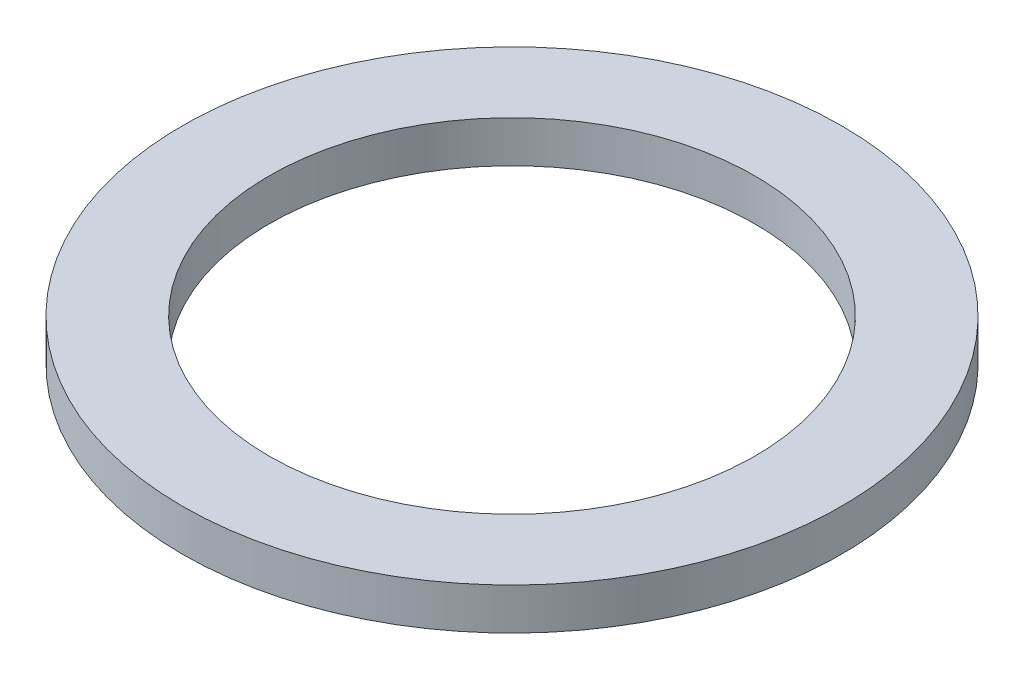
ISO-10303-21;
HEADER;
FILE_DESCRIPTION(('STEP AP214'),'2;1');
FILE_NAME('part.step','',(''),(''),'','','');
FILE_SCHEMA(('AUTOMOTIVE_DESIGN { 1 0 10303 214 1 1 1 1 }'));
ENDSEC;
DATA;
#1=APPLICATION_CONTEXT('core data for automotive mechanical design processes');
#2=APPLICATION_PROTOCOL_DEFINITION('international standard','automotive_design',2000,#1);
#3=PRODUCT_CONTEXT('',#1,'mechanical');
#4=PRODUCT('Part','Part','',(#3));
#5=PRODUCT_RELATED_PRODUCT_CATEGORY('part','',(#4));
#6=PRODUCT_DEFINITION_FORMATION('','',#4);
#7=PRODUCT_DEFINITION_CONTEXT('part definition',#1,'design');
#8=PRODUCT_DEFINITION('design','',#6,#7);
#9=PRODUCT_DEFINITION_SHAPE('','',#8);
#10=(LENGTH_UNIT() NAMED_UNIT(*) SI_UNIT(.MILLI.,.METRE.));
#11=(NAMED_UNIT(*) PLANE_ANGLE_UNIT() SI_UNIT($,.RADIAN.));
#12=(NAMED_UNIT(*) SI_UNIT($,.STERADIAN.) SOLID_ANGLE_UNIT());
#13=UNCERTAINTY_MEASURE_WITH_UNIT(LENGTH_MEASURE(1.E-05),#10,'distance_accuracy_value','');
#14=(GEOMETRIC_REPRESENTATION_CONTEXT(3) GLOBAL_UNCERTAINTY_ASSIGNED_CONTEXT((#13)) GLOBAL_UNIT_ASSIGNED_CONTEXT((#10,
#11,#12)) REPRESENTATION_CONTEXT('',''));
#15=CARTESIAN_POINT('',(0.,0.,0.));
#16=DIRECTION('',(0.,0.,1.));
#17=DIRECTION('',(1.,0.,0.));
#18=AXIS2_PLACEMENT_3D('',#15,#16,#17);
#19=CARTESIAN_POINT('',(0.,6.,0.));
#20=DIRECTION('',(0.,1.,0.));
#21=DIRECTION('',(0.,0.,1.));
#22=AXIS2_PLACEMENT_3D('',#19,#20,#21);
#23=PLANE('',#22);
#24=CARTESIAN_POINT('',(0.,6.,0.));
#25=DIRECTION('',(0.,1.,0.));
#26=DIRECTION('',(0.,0.,1.));
#27=AXIS2_PLACEMENT_3D('',#24,#25,#26);
#28=CIRCLE('',#27,47.5);
#29=CARTESIAN_POINT('',(0.,6.,47.5));
#30=VERTEX_POINT('',#29);
#31=EDGE_CURVE('E10',#30,#30,#28,.T.);
#32=ORIENTED_EDGE('',*,*,#31,.T.);
#33=EDGE_LOOP('',(#32));
#34=FACE_BOUND('',#33,.T.);
#35=CARTESIAN_POINT('',(0.,6.,0.));
#36=DIRECTION('',(0.,1.,0.));
#37=DIRECTION('',(0.,0.,1.));
#38=AXIS2_PLACEMENT_3D('',#35,#36,#37);
#39=CIRCLE('',#38,35.);
#40=CARTESIAN_POINT('',(0.,6.,35.));
#41=VERTEX_POINT('',#40);
#42=EDGE_CURVE('E54',#41,#41,#39,.T.);
#43=ORIENTED_EDGE('',*,*,#42,.F.);
#44=EDGE_LOOP('',(#43));
#45=FACE_BOUND('',#44,.T.);
#46=ADVANCED_FACE('F41',(#34,#45),#23,.T.);
#47=CARTESIAN_POINT('',(0.,0.,0.));
#48=DIRECTION('',(0.,1.,0.));
#49=DIRECTION('',(0.,0.,1.));
#50=AXIS2_PLACEMENT_3D('',#47,#48,#49);
#51=PLANE('',#50);
#52=CARTESIAN_POINT('',(0.,0.,0.));
#53=DIRECTION('',(0.,1.,0.));
#54=DIRECTION('',(0.,0.,1.));
#55=AXIS2_PLACEMENT_3D('',#52,#53,#54);
#56=CIRCLE('',#55,47.5);
#57=CARTESIAN_POINT('',(0.,0.,47.5));
#58=VERTEX_POINT('',#57);
#59=EDGE_CURVE('E45',#58,#58,#56,.T.);
#60=ORIENTED_EDGE('',*,*,#59,.F.);
#61=EDGE_LOOP('',(#60));
#62=FACE_BOUND('',#61,.T.);
#63=CARTESIAN_POINT('',(0.,0.,0.));
#64=DIRECTION('',(0.,1.,0.));
#65=DIRECTION('',(0.,0.,1.));
#66=AXIS2_PLACEMENT_3D('',#63,#64,#65);
#67=CIRCLE('',#66,35.);
#68=CARTESIAN_POINT('',(0.,0.,35.));
#69=VERTEX_POINT('',#68);
#70=EDGE_CURVE('E56',#69,#69,#67,.T.);
#71=ORIENTED_EDGE('',*,*,#70,.T.);
#72=EDGE_LOOP('',(#71));
#73=FACE_BOUND('',#72,.T.);
#74=ADVANCED_FACE('F68',(#62,#73),#51,.F.);
#75=CARTESIAN_POINT('',(0.,6.,0.));
#76=DIRECTION('',(0.,-1.,0.));
#77=DIRECTION('',(0.,0.,-1.));
#78=AXIS2_PLACEMENT_3D('',#75,#76,#77);
#79=CYLINDRICAL_SURFACE('',#78,47.5);
#80=ORIENTED_EDGE('',*,*,#31,.F.);
#81=EDGE_LOOP('',(#80));
#82=FACE_BOUND('',#81,.T.);
#83=ORIENTED_EDGE('',*,*,#59,.T.);
#84=EDGE_LOOP('',(#83));
#85=FACE_BOUND('',#84,.T.);
#86=ADVANCED_FACE('F43',(#82,#85),#79,.T.);
#87=CARTESIAN_POINT('',(0.,6.,0.));
#88=DIRECTION('',(0.,-1.,0.));
#89=DIRECTION('',(0.,0.,-1.));
#90=AXIS2_PLACEMENT_3D('',#87,#88,#89);
#91=CYLINDRICAL_SURFACE('',#90,35.);
#92=ORIENTED_EDGE('',*,*,#42,.T.);
#93=EDGE_LOOP('',(#92));
#94=FACE_BOUND('',#93,.T.);
#95=ORIENTED_EDGE('',*,*,#70,.F.);
#96=EDGE_LOOP('',(#95));
#97=FACE_BOUND('',#96,.T.);
#98=ADVANCED_FACE('F64',(#94,#97),#91,.F.);
#99=CLOSED_SHELL('',(#46,#74,#86,#98));
#100=MANIFOLD_SOLID_BREP('B2',#99);
#101=ADVANCED_BREP_SHAPE_REPRESENTATION('',(#18,#100),#14);
#102=SHAPE_DEFINITION_REPRESENTATION(#9,#101);
ENDSEC;
END-ISO-10303-21;
